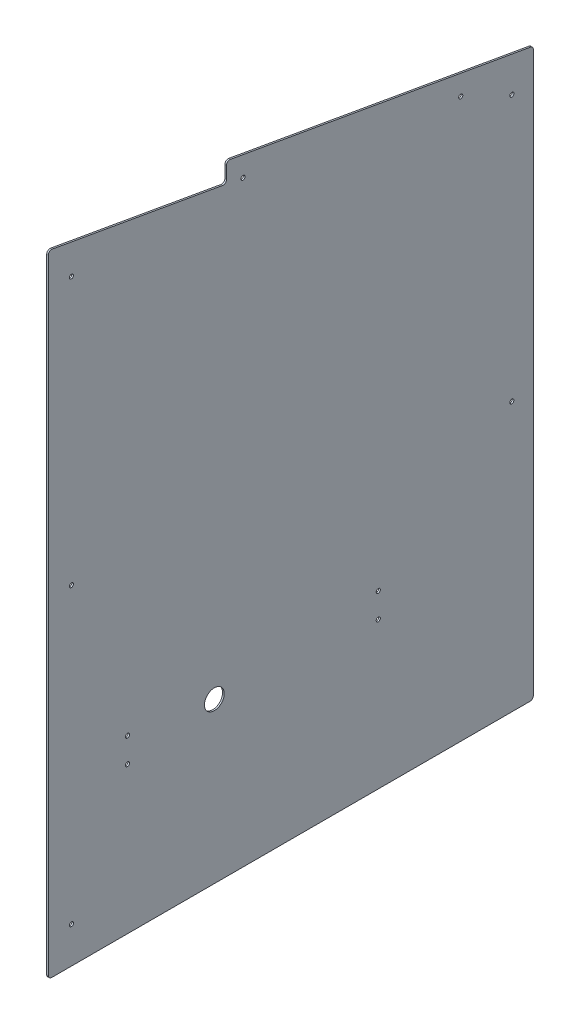
ISO-10303-21;
HEADER;
FILE_DESCRIPTION(('STEP AP214'),'2;1');
FILE_NAME('part.step','',(''),(''),'','','');
FILE_SCHEMA(('AUTOMOTIVE_DESIGN { 1 0 10303 214 1 1 1 1 }'));
ENDSEC;
DATA;
#1=APPLICATION_CONTEXT('core data for automotive mechanical design processes');
#2=APPLICATION_PROTOCOL_DEFINITION('international standard','automotive_design',2000,#1);
#3=PRODUCT_CONTEXT('',#1,'mechanical');
#4=PRODUCT('Part','Part','',(#3));
#5=PRODUCT_RELATED_PRODUCT_CATEGORY('part','',(#4));
#6=PRODUCT_DEFINITION_FORMATION('','',#4);
#7=PRODUCT_DEFINITION_CONTEXT('part definition',#1,'design');
#8=PRODUCT_DEFINITION('design','',#6,#7);
#9=PRODUCT_DEFINITION_SHAPE('','',#8);
#10=(LENGTH_UNIT() NAMED_UNIT(*) SI_UNIT(.MILLI.,.METRE.));
#11=(NAMED_UNIT(*) PLANE_ANGLE_UNIT() SI_UNIT($,.RADIAN.));
#12=(NAMED_UNIT(*) SI_UNIT($,.STERADIAN.) SOLID_ANGLE_UNIT());
#13=UNCERTAINTY_MEASURE_WITH_UNIT(LENGTH_MEASURE(1.E-05),#10,'distance_accuracy_value','');
#14=(GEOMETRIC_REPRESENTATION_CONTEXT(3) GLOBAL_UNCERTAINTY_ASSIGNED_CONTEXT((#13)) GLOBAL_UNIT_ASSIGNED_CONTEXT((#10,
#11,#12)) REPRESENTATION_CONTEXT('',''));
#15=CARTESIAN_POINT('',(0.,0.,0.));
#16=DIRECTION('',(0.,0.,1.));
#17=DIRECTION('',(1.,0.,0.));
#18=AXIS2_PLACEMENT_3D('',#15,#16,#17);
#19=CARTESIAN_POINT('',(3.175,1214.92966622947,0.));
#20=DIRECTION('',(0.,0.,-1.));
#21=DIRECTION('',(0.,1.,0.));
#22=AXIS2_PLACEMENT_3D('',#19,#20,#21);
#23=PLANE('',#22);
#24=DIRECTION('',(0.,-1.,0.));
#25=VECTOR('',#24,1.);
#26=CARTESIAN_POINT('',(0.,1214.92966622947,0.));
#27=LINE('',#26,#25);
#28=CARTESIAN_POINT('',(0.,1207.36203091649,0.));
#29=VERTEX_POINT('',#28);
#30=CARTESIAN_POINT('',(0.,6.35000000000008,0.));
#31=VERTEX_POINT('',#30);
#32=EDGE_CURVE('E157',#29,#31,#27,.T.);
#33=ORIENTED_EDGE('',*,*,#32,.T.);
#34=DIRECTION('',(-1.,0.,0.));
#35=VECTOR('',#34,1.);
#36=CARTESIAN_POINT('',(3.175,6.35000000000008,0.));
#37=LINE('',#36,#35);
#38=CARTESIAN_POINT('',(3.175,6.35000000000008,0.));
#39=VERTEX_POINT('',#38);
#40=EDGE_CURVE('E189',#31,#39,#37,.F.);
#41=ORIENTED_EDGE('',*,*,#40,.T.);
#42=DIRECTION('',(0.,-1.,0.));
#43=VECTOR('',#42,1.);
#44=CARTESIAN_POINT('',(3.175,1214.92966622947,0.));
#45=LINE('',#44,#43);
#46=CARTESIAN_POINT('',(3.175,1207.36203091649,0.));
#47=VERTEX_POINT('',#46);
#48=EDGE_CURVE('E165',#47,#39,#45,.T.);
#49=ORIENTED_EDGE('',*,*,#48,.F.);
#50=DIRECTION('',(-1.,0.,0.));
#51=VECTOR('',#50,1.);
#52=CARTESIAN_POINT('',(3.175,1207.36203091649,0.));
#53=LINE('',#52,#51);
#54=EDGE_CURVE('E186',#47,#29,#53,.T.);
#55=ORIENTED_EDGE('',*,*,#54,.T.);
#56=EDGE_LOOP('',(#33,#41,#49,#55));
#57=FACE_BOUND('',#56,.T.);
#58=ADVANCED_FACE('F35',(#57),#23,.F.);
#59=CARTESIAN_POINT('',(3.175,0.,0.));
#60=DIRECTION('',(0.,1.,0.));
#61=DIRECTION('',(0.,0.,1.));
#62=AXIS2_PLACEMENT_3D('',#59,#60,#61);
#63=PLANE('',#62);
#64=DIRECTION('',(0.,0.,-1.));
#65=VECTOR('',#64,1.);
#66=CARTESIAN_POINT('',(0.,0.,0.));
#67=LINE('',#66,#65);
#68=CARTESIAN_POINT('',(0.,0.,-6.35));
#69=VERTEX_POINT('',#68);
#70=CARTESIAN_POINT('',(0.,0.,-927.1));
#71=VERTEX_POINT('',#70);
#72=EDGE_CURVE('E152',#69,#71,#67,.T.);
#73=ORIENTED_EDGE('',*,*,#72,.T.);
#74=DIRECTION('',(-1.,0.,0.));
#75=VECTOR('',#74,1.);
#76=CARTESIAN_POINT('',(3.175,0.,-927.1));
#77=LINE('',#76,#75);
#78=CARTESIAN_POINT('',(3.175,0.,-927.1));
#79=VERTEX_POINT('',#78);
#80=EDGE_CURVE('E129',#71,#79,#77,.F.);
#81=ORIENTED_EDGE('',*,*,#80,.T.);
#82=DIRECTION('',(0.,0.,-1.));
#83=VECTOR('',#82,1.);
#84=CARTESIAN_POINT('',(3.175,0.,0.));
#85=LINE('',#84,#83);
#86=CARTESIAN_POINT('',(3.175,0.,-6.35));
#87=VERTEX_POINT('',#86);
#88=EDGE_CURVE('E239',#87,#79,#85,.T.);
#89=ORIENTED_EDGE('',*,*,#88,.F.);
#90=DIRECTION('',(-1.,0.,0.));
#91=VECTOR('',#90,1.);
#92=CARTESIAN_POINT('',(3.175,0.,-6.35));
#93=LINE('',#92,#91);
#94=EDGE_CURVE('E134',#87,#69,#93,.T.);
#95=ORIENTED_EDGE('',*,*,#94,.T.);
#96=EDGE_LOOP('',(#73,#81,#89,#95));
#97=FACE_BOUND('',#96,.T.);
#98=ADVANCED_FACE('F259',(#97),#63,.F.);
#99=CARTESIAN_POINT('',(3.175,0.,-933.45));
#100=DIRECTION('',(0.,0.,1.));
#101=DIRECTION('',(1.,0.,0.));
#102=AXIS2_PLACEMENT_3D('',#99,#100,#101);
#103=PLANE('',#102);
#104=DIRECTION('',(0.,1.,0.));
#105=VECTOR('',#104,1.);
#106=CARTESIAN_POINT('',(3.175,0.,-933.45));
#107=LINE('',#106,#105);
#108=CARTESIAN_POINT('',(3.175,6.35,-933.45));
#109=VERTEX_POINT('',#108);
#110=CARTESIAN_POINT('',(3.175,1083.69671734202,-933.45));
#111=VERTEX_POINT('',#110);
#112=EDGE_CURVE('E144',#109,#111,#107,.T.);
#113=ORIENTED_EDGE('',*,*,#112,.F.);
#114=DIRECTION('',(-1.,0.,0.));
#115=VECTOR('',#114,1.);
#116=CARTESIAN_POINT('',(3.175,6.35,-933.45));
#117=LINE('',#116,#115);
#118=CARTESIAN_POINT('',(0.,6.35,-933.45));
#119=VERTEX_POINT('',#118);
#120=EDGE_CURVE('E128',#109,#119,#117,.T.);
#121=ORIENTED_EDGE('',*,*,#120,.T.);
#122=DIRECTION('',(0.,1.,0.));
#123=VECTOR('',#122,1.);
#124=CARTESIAN_POINT('',(0.,0.,-933.45));
#125=LINE('',#124,#123);
#126=CARTESIAN_POINT('',(0.,1083.69671734202,-933.45));
#127=VERTEX_POINT('',#126);
#128=EDGE_CURVE('E141',#119,#127,#125,.T.);
#129=ORIENTED_EDGE('',*,*,#128,.T.);
#130=DIRECTION('',(-1.,0.,0.));
#131=VECTOR('',#130,1.);
#132=CARTESIAN_POINT('',(3.175,1083.69671734202,-933.45));
#133=LINE('',#132,#131);
#134=EDGE_CURVE('E146',#127,#111,#133,.F.);
#135=ORIENTED_EDGE('',*,*,#134,.T.);
#136=EDGE_LOOP('',(#113,#121,#129,#135));
#137=FACE_BOUND('',#136,.T.);
#138=ADVANCED_FACE('F140',(#137),#103,.F.);
#139=CARTESIAN_POINT('',(3.175,1089.025,-933.45));
#140=DIRECTION('',(0.,-0.984807753012209,0.173648177666926));
#141=DIRECTION('',(0.,-0.173648177666926,-0.984807753012209));
#142=AXIS2_PLACEMENT_3D('',#139,#140,#141);
#143=PLANE('',#142);
#144=DIRECTION('',(0.,0.173648177666926,0.984807753012209));
#145=VECTOR('',#144,1.);
#146=CARTESIAN_POINT('',(3.175,1089.025,-933.45));
#147=LINE('',#146,#145);
#148=CARTESIAN_POINT('',(3.175,1089.95024657365,-928.202665928185));
#149=VERTEX_POINT('',#148);
#150=CARTESIAN_POINT('',(3.175,1191.84079237604,-350.352665928185));
#151=VERTEX_POINT('',#150);
#152=EDGE_CURVE('E218',#149,#151,#147,.T.);
#153=ORIENTED_EDGE('',*,*,#152,.F.);
#154=DIRECTION('',(-1.,0.,0.));
#155=VECTOR('',#154,1.);
#156=CARTESIAN_POINT('',(3.175,1089.95024657365,-928.202665928185));
#157=LINE('',#156,#155);
#158=CARTESIAN_POINT('',(0.,1089.95024657365,-928.202665928185));
#159=VERTEX_POINT('',#158);
#160=EDGE_CURVE('E193',#149,#159,#157,.T.);
#161=ORIENTED_EDGE('',*,*,#160,.T.);
#162=DIRECTION('',(0.,0.173648177666926,0.984807753012209));
#163=VECTOR('',#162,1.);
#164=CARTESIAN_POINT('',(0.,1089.025,-933.45));
#165=LINE('',#164,#163);
#166=CARTESIAN_POINT('',(0.,1191.84079237604,-350.352665928185));
#167=VERTEX_POINT('',#166);
#168=EDGE_CURVE('E151',#159,#167,#165,.T.);
#169=ORIENTED_EDGE('',*,*,#168,.T.);
#170=DIRECTION('',(-1.,0.,0.));
#171=VECTOR('',#170,1.);
#172=CARTESIAN_POINT('',(3.175,1191.84079237604,-350.352665928185));
#173=LINE('',#172,#171);
#174=EDGE_CURVE('E191',#167,#151,#173,.F.);
#175=ORIENTED_EDGE('',*,*,#174,.T.);
#176=EDGE_LOOP('',(#153,#161,#169,#175));
#177=FACE_BOUND('',#176,.T.);
#178=ADVANCED_FACE('F252',(#177),#143,.F.);
#179=CARTESIAN_POINT('',(3.175,1193.15489845738,-342.9));
#180=DIRECTION('',(0.,0.,-1.));
#181=DIRECTION('',(-1.,0.,0.));
#182=AXIS2_PLACEMENT_3D('',#179,#180,#181);
#183=PLANE('',#182);
#184=DIRECTION('',(0.,-1.,0.));
#185=VECTOR('',#184,1.);
#186=CARTESIAN_POINT('',(3.175,1193.15489845738,-342.9));
#187=LINE('',#186,#185);
#188=CARTESIAN_POINT('',(3.175,1185.58726314441,-342.9));
#189=VERTEX_POINT('',#188);
#190=CARTESIAN_POINT('',(3.175,1162.03477985751,-342.9));
#191=VERTEX_POINT('',#190);
#192=EDGE_CURVE('E216',#189,#191,#187,.T.);
#193=ORIENTED_EDGE('',*,*,#192,.F.);
#194=DIRECTION('',(-1.,0.,0.));
#195=VECTOR('',#194,1.);
#196=CARTESIAN_POINT('',(3.175,1185.58726314441,-342.9));
#197=LINE('',#196,#195);
#198=CARTESIAN_POINT('',(0.,1185.58726314441,-342.9));
#199=VERTEX_POINT('',#198);
#200=EDGE_CURVE('E198',#189,#199,#197,.T.);
#201=ORIENTED_EDGE('',*,*,#200,.T.);
#202=DIRECTION('',(0.,-1.,0.));
#203=VECTOR('',#202,1.);
#204=CARTESIAN_POINT('',(0.,1193.15489845738,-342.9));
#205=LINE('',#204,#203);
#206=CARTESIAN_POINT('',(0.,1162.03477985751,-342.9));
#207=VERTEX_POINT('',#206);
#208=EDGE_CURVE('E155',#199,#207,#205,.T.);
#209=ORIENTED_EDGE('',*,*,#208,.T.);
#210=DIRECTION('',(-1.,0.,0.));
#211=VECTOR('',#210,1.);
#212=CARTESIAN_POINT('',(3.175,1162.03477985751,-342.9));
#213=LINE('',#212,#211);
#214=EDGE_CURVE('E196',#207,#191,#213,.F.);
#215=ORIENTED_EDGE('',*,*,#214,.T.);
#216=EDGE_LOOP('',(#193,#201,#209,#215));
#217=FACE_BOUND('',#216,.T.);
#218=ADVANCED_FACE('F211',(#217),#183,.F.);
#219=CARTESIAN_POINT('',(3.175,1154.46714454453,-342.9));
#220=DIRECTION('',(0.,-0.984807753012209,0.173648177666927));
#221=DIRECTION('',(0.,-0.173648177666927,-0.984807753012209));
#222=AXIS2_PLACEMENT_3D('',#219,#220,#221);
#223=PLANE('',#222);
#224=DIRECTION('',(0.,0.173648177666927,0.984807753012209));
#225=VECTOR('',#224,1.);
#226=CARTESIAN_POINT('',(3.175,1154.46714454453,-342.9));
#227=LINE('',#226,#225);
#228=CARTESIAN_POINT('',(3.175,1155.78125062588,-335.447334071815));
#229=VERTEX_POINT('',#228);
#230=CARTESIAN_POINT('',(3.175,1213.61556014812,-7.45266592818505));
#231=VERTEX_POINT('',#230);
#232=EDGE_CURVE('E166',#229,#231,#227,.T.);
#233=ORIENTED_EDGE('',*,*,#232,.F.);
#234=DIRECTION('',(-1.,0.,0.));
#235=VECTOR('',#234,1.);
#236=CARTESIAN_POINT('',(0.,1155.78125062588,-335.447334071815));
#237=LINE('',#236,#235);
#238=CARTESIAN_POINT('',(0.,1155.78125062588,-335.447334071815));
#239=VERTEX_POINT('',#238);
#240=EDGE_CURVE('E202',#229,#239,#237,.T.);
#241=ORIENTED_EDGE('',*,*,#240,.T.);
#242=DIRECTION('',(0.,0.173648177666927,0.984807753012209));
#243=VECTOR('',#242,1.);
#244=CARTESIAN_POINT('',(0.,1154.46714454453,-342.9));
#245=LINE('',#244,#243);
#246=CARTESIAN_POINT('',(0.,1213.61556014812,-7.45266592818505));
#247=VERTEX_POINT('',#246);
#248=EDGE_CURVE('E163',#239,#247,#245,.T.);
#249=ORIENTED_EDGE('',*,*,#248,.T.);
#250=DIRECTION('',(-1.,0.,0.));
#251=VECTOR('',#250,1.);
#252=CARTESIAN_POINT('',(3.175,1213.61556014812,-7.452665928185));
#253=LINE('',#252,#251);
#254=EDGE_CURVE('E50',#247,#231,#253,.F.);
#255=ORIENTED_EDGE('',*,*,#254,.T.);
#256=EDGE_LOOP('',(#233,#241,#249,#255));
#257=FACE_BOUND('',#256,.T.);
#258=ADVANCED_FACE('F214',(#257),#223,.F.);
#259=CARTESIAN_POINT('',(3.175,0.,0.));
#260=DIRECTION('',(1.,0.,0.));
#261=DIRECTION('',(0.,0.,-1.));
#262=AXIS2_PLACEMENT_3D('',#259,#260,#261);
#263=PLANE('',#262);
#264=CARTESIAN_POINT('',(3.175,1149.35,-44.45));
#265=DIRECTION('',(1.,0.,0.));
#266=DIRECTION('',(0.,0.,-1.));
#267=AXIS2_PLACEMENT_3D('',#264,#265,#266);
#268=CIRCLE('',#267,3.96875000000008);
#269=CARTESIAN_POINT('',(3.175,1149.35,-48.4187500000001));
#270=VERTEX_POINT('',#269);
#271=EDGE_CURVE('E481',#270,#270,#268,.T.);
#272=ORIENTED_EDGE('',*,*,#271,.F.);
#273=EDGE_LOOP('',(#272));
#274=FACE_BOUND('',#273,.T.);
#275=CARTESIAN_POINT('',(3.175,635.,-44.45));
#276=DIRECTION('',(1.,0.,0.));
#277=DIRECTION('',(0.,0.,-1.));
#278=AXIS2_PLACEMENT_3D('',#275,#276,#277);
#279=CIRCLE('',#278,3.96874999999997);
#280=CARTESIAN_POINT('',(3.175,635.,-48.41875));
#281=VERTEX_POINT('',#280);
#282=EDGE_CURVE('E483',#281,#281,#279,.T.);
#283=ORIENTED_EDGE('',*,*,#282,.F.);
#284=EDGE_LOOP('',(#283));
#285=FACE_BOUND('',#284,.T.);
#286=CARTESIAN_POINT('',(3.175,330.2,-152.4));
#287=DIRECTION('',(1.,0.,0.));
#288=DIRECTION('',(0.,0.,-1.));
#289=AXIS2_PLACEMENT_3D('',#286,#287,#288);
#290=CIRCLE('',#289,3.96874999999997);
#291=CARTESIAN_POINT('',(3.175,330.2,-156.36875));
#292=VERTEX_POINT('',#291);
#293=EDGE_CURVE('E491',#292,#292,#290,.T.);
#294=ORIENTED_EDGE('',*,*,#293,.F.);
#295=EDGE_LOOP('',(#294));
#296=FACE_BOUND('',#295,.T.);
#297=CARTESIAN_POINT('',(3.175,282.575,-152.4));
#298=DIRECTION('',(1.,0.,0.));
#299=DIRECTION('',(0.,0.,-1.));
#300=AXIS2_PLACEMENT_3D('',#297,#298,#299);
#301=CIRCLE('',#300,3.96874999999997);
#302=CARTESIAN_POINT('',(3.175,282.575,-156.36875));
#303=VERTEX_POINT('',#302);
#304=EDGE_CURVE('E497',#303,#303,#301,.T.);
#305=ORIENTED_EDGE('',*,*,#304,.F.);
#306=EDGE_LOOP('',(#305));
#307=FACE_BOUND('',#306,.T.);
#308=CARTESIAN_POINT('',(3.175,330.2,-635.));
#309=DIRECTION('',(1.,0.,0.));
#310=DIRECTION('',(0.,0.,-1.));
#311=AXIS2_PLACEMENT_3D('',#308,#309,#310);
#312=CIRCLE('',#311,3.96874999999997);
#313=CARTESIAN_POINT('',(3.175,330.2,-638.96875));
#314=VERTEX_POINT('',#313);
#315=EDGE_CURVE('E503',#314,#314,#312,.T.);
#316=ORIENTED_EDGE('',*,*,#315,.F.);
#317=EDGE_LOOP('',(#316));
#318=FACE_BOUND('',#317,.T.);
#319=CARTESIAN_POINT('',(3.175,282.575,-635.));
#320=DIRECTION('',(1.,0.,0.));
#321=DIRECTION('',(0.,0.,-1.));
#322=AXIS2_PLACEMENT_3D('',#319,#320,#321);
#323=CIRCLE('',#322,3.96874999999997);
#324=CARTESIAN_POINT('',(3.175,282.575,-638.96875));
#325=VERTEX_POINT('',#324);
#326=EDGE_CURVE('E509',#325,#325,#323,.T.);
#327=ORIENTED_EDGE('',*,*,#326,.F.);
#328=EDGE_LOOP('',(#327));
#329=FACE_BOUND('',#328,.T.);
#330=CARTESIAN_POINT('',(3.175,517.525,-892.175));
#331=DIRECTION('',(1.,0.,0.));
#332=DIRECTION('',(0.,0.,-1.));
#333=AXIS2_PLACEMENT_3D('',#330,#331,#332);
#334=CIRCLE('',#333,3.96874999999997);
#335=CARTESIAN_POINT('',(3.175,517.525,-896.14375));
#336=VERTEX_POINT('',#335);
#337=EDGE_CURVE('E515',#336,#336,#334,.T.);
#338=ORIENTED_EDGE('',*,*,#337,.F.);
#339=EDGE_LOOP('',(#338));
#340=FACE_BOUND('',#339,.T.);
#341=CARTESIAN_POINT('',(3.175,1028.7,-892.175));
#342=DIRECTION('',(1.,0.,0.));
#343=DIRECTION('',(0.,0.,-1.));
#344=AXIS2_PLACEMENT_3D('',#341,#342,#343);
#345=CIRCLE('',#344,3.96875000000008);
#346=CARTESIAN_POINT('',(3.175,1028.7,-896.14375));
#347=VERTEX_POINT('',#346);
#348=EDGE_CURVE('E521',#347,#347,#345,.T.);
#349=ORIENTED_EDGE('',*,*,#348,.F.);
#350=EDGE_LOOP('',(#349));
#351=FACE_BOUND('',#350,.T.);
#352=CARTESIAN_POINT('',(3.175,1148.86876290704,-374.65));
#353=DIRECTION('',(1.,0.,0.));
#354=DIRECTION('',(0.,0.,-1.));
#355=AXIS2_PLACEMENT_3D('',#352,#353,#354);
#356=CIRCLE('',#355,3.96875000000008);
#357=CARTESIAN_POINT('',(3.175,1148.86876290704,-378.61875));
#358=VERTEX_POINT('',#357);
#359=EDGE_CURVE('E527',#358,#358,#356,.T.);
#360=ORIENTED_EDGE('',*,*,#359,.F.);
#361=EDGE_LOOP('',(#360));
#362=FACE_BOUND('',#361,.T.);
#363=CARTESIAN_POINT('',(3.175,1074.97012529213,-793.75));
#364=DIRECTION('',(1.,0.,0.));
#365=DIRECTION('',(0.,0.,-1.));
#366=AXIS2_PLACEMENT_3D('',#363,#364,#365);
#367=CIRCLE('',#366,3.96875000000008);
#368=CARTESIAN_POINT('',(3.175,1074.97012529213,-797.71875));
#369=VERTEX_POINT('',#368);
#370=EDGE_CURVE('E533',#369,#369,#367,.T.);
#371=ORIENTED_EDGE('',*,*,#370,.F.);
#372=EDGE_LOOP('',(#371));
#373=FACE_BOUND('',#372,.T.);
#374=CARTESIAN_POINT('',(3.175,69.85,-44.45));
#375=DIRECTION('',(1.,0.,0.));
#376=DIRECTION('',(0.,0.,-1.));
#377=AXIS2_PLACEMENT_3D('',#374,#375,#376);
#378=CIRCLE('',#377,3.96874999999999);
#379=CARTESIAN_POINT('',(3.175,69.85,-48.41875));
#380=VERTEX_POINT('',#379);
#381=EDGE_CURVE('E538',#380,#380,#378,.T.);
#382=ORIENTED_EDGE('',*,*,#381,.F.);
#383=EDGE_LOOP('',(#382));
#384=FACE_BOUND('',#383,.T.);
#385=CARTESIAN_POINT('',(3.175,307.34,-319.532));
#386=DIRECTION('',(1.,0.,0.));
#387=DIRECTION('',(0.,0.,-1.));
#388=AXIS2_PLACEMENT_3D('',#385,#386,#387);
#389=CIRCLE('',#388,19.05);
#390=CARTESIAN_POINT('',(3.175,307.34,-338.582));
#391=VERTEX_POINT('',#390);
#392=EDGE_CURVE('E227',#391,#391,#389,.T.);
#393=ORIENTED_EDGE('',*,*,#392,.F.);
#394=EDGE_LOOP('',(#393));
#395=FACE_BOUND('',#394,.T.);
#396=ORIENTED_EDGE('',*,*,#88,.T.);
#397=CARTESIAN_POINT('',(3.175,6.35,-927.1));
#398=DIRECTION('',(1.,0.,0.));
#399=DIRECTION('',(0.,0.,-1.));
#400=AXIS2_PLACEMENT_3D('',#397,#398,#399);
#401=CIRCLE('',#400,6.35);
#402=EDGE_CURVE('E184',#79,#109,#401,.T.);
#403=ORIENTED_EDGE('',*,*,#402,.T.);
#404=ORIENTED_EDGE('',*,*,#112,.T.);
#405=CARTESIAN_POINT('',(3.175,1083.69671734202,-927.1));
#406=DIRECTION('',(1.,0.,0.));
#407=DIRECTION('',(0.,0.,-1.));
#408=AXIS2_PLACEMENT_3D('',#405,#406,#407);
#409=CIRCLE('',#408,6.35);
#410=EDGE_CURVE('E180',#111,#149,#409,.T.);
#411=ORIENTED_EDGE('',*,*,#410,.T.);
#412=ORIENTED_EDGE('',*,*,#152,.T.);
#413=CARTESIAN_POINT('',(3.175,1185.58726314441,-349.25));
#414=DIRECTION('',(1.,0.,0.));
#415=DIRECTION('',(0.,0.,-1.));
#416=AXIS2_PLACEMENT_3D('',#413,#414,#415);
#417=CIRCLE('',#416,6.35);
#418=EDGE_CURVE('E178',#151,#189,#417,.T.);
#419=ORIENTED_EDGE('',*,*,#418,.T.);
#420=ORIENTED_EDGE('',*,*,#192,.T.);
#421=CARTESIAN_POINT('',(3.175,1162.03477985751,-336.55));
#422=DIRECTION('',(1.,0.,0.));
#423=DIRECTION('',(0.,0.,-1.));
#424=AXIS2_PLACEMENT_3D('',#421,#422,#423);
#425=CIRCLE('',#424,6.35);
#426=EDGE_CURVE('E11',#191,#229,#425,.F.);
#427=ORIENTED_EDGE('',*,*,#426,.T.);
#428=ORIENTED_EDGE('',*,*,#232,.T.);
#429=CARTESIAN_POINT('',(3.175,1207.36203091649,-6.35));
#430=DIRECTION('',(1.,0.,0.));
#431=DIRECTION('',(0.,0.,-1.));
#432=AXIS2_PLACEMENT_3D('',#429,#430,#431);
#433=CIRCLE('',#432,6.35);
#434=EDGE_CURVE('E176',#231,#47,#433,.T.);
#435=ORIENTED_EDGE('',*,*,#434,.T.);
#436=ORIENTED_EDGE('',*,*,#48,.T.);
#437=CARTESIAN_POINT('',(3.175,6.35,-6.35));
#438=DIRECTION('',(1.,0.,0.));
#439=DIRECTION('',(0.,0.,-1.));
#440=AXIS2_PLACEMENT_3D('',#437,#438,#439);
#441=CIRCLE('',#440,6.35);
#442=EDGE_CURVE('E182',#39,#87,#441,.T.);
#443=ORIENTED_EDGE('',*,*,#442,.T.);
#444=EDGE_LOOP('',(#396,#403,#404,#411,#412,#419,#420,#427,#428,#435,#436,#443));
#445=FACE_BOUND('',#444,.T.);
#446=ADVANCED_FACE('F245',(#274,#285,#296,#307,#318,#329,#340,#351,#362,#373,#384,#395,#445),
#263,.T.);
#447=CARTESIAN_POINT('',(0.,0.,0.));
#448=DIRECTION('',(1.,0.,0.));
#449=DIRECTION('',(0.,0.,-1.));
#450=AXIS2_PLACEMENT_3D('',#447,#448,#449);
#451=PLANE('',#450);
#452=CARTESIAN_POINT('',(0.,1149.35,-44.45));
#453=DIRECTION('',(1.,0.,0.));
#454=DIRECTION('',(0.,0.,-1.));
#455=AXIS2_PLACEMENT_3D('',#452,#453,#454);
#456=CIRCLE('',#455,3.96875000000008);
#457=CARTESIAN_POINT('',(0.,1149.35,-48.4187500000001));
#458=VERTEX_POINT('',#457);
#459=EDGE_CURVE('E478',#458,#458,#456,.T.);
#460=ORIENTED_EDGE('',*,*,#459,.T.);
#461=EDGE_LOOP('',(#460));
#462=FACE_BOUND('',#461,.T.);
#463=CARTESIAN_POINT('',(0.,635.,-44.45));
#464=DIRECTION('',(1.,0.,0.));
#465=DIRECTION('',(0.,0.,-1.));
#466=AXIS2_PLACEMENT_3D('',#463,#464,#465);
#467=CIRCLE('',#466,3.96874999999997);
#468=CARTESIAN_POINT('',(0.,635.,-48.41875));
#469=VERTEX_POINT('',#468);
#470=EDGE_CURVE('E488',#469,#469,#467,.T.);
#471=ORIENTED_EDGE('',*,*,#470,.T.);
#472=EDGE_LOOP('',(#471));
#473=FACE_BOUND('',#472,.T.);
#474=CARTESIAN_POINT('',(0.,330.2,-152.4));
#475=DIRECTION('',(1.,0.,0.));
#476=DIRECTION('',(0.,0.,-1.));
#477=AXIS2_PLACEMENT_3D('',#474,#475,#476);
#478=CIRCLE('',#477,3.96875000000002);
#479=CARTESIAN_POINT('',(0.,330.2,-156.36875));
#480=VERTEX_POINT('',#479);
#481=EDGE_CURVE('E494',#480,#480,#478,.T.);
#482=ORIENTED_EDGE('',*,*,#481,.T.);
#483=EDGE_LOOP('',(#482));
#484=FACE_BOUND('',#483,.T.);
#485=CARTESIAN_POINT('',(0.,282.575,-152.4));
#486=DIRECTION('',(1.,0.,0.));
#487=DIRECTION('',(0.,0.,-1.));
#488=AXIS2_PLACEMENT_3D('',#485,#486,#487);
#489=CIRCLE('',#488,3.96875000000002);
#490=CARTESIAN_POINT('',(0.,282.575,-156.36875));
#491=VERTEX_POINT('',#490);
#492=EDGE_CURVE('E500',#491,#491,#489,.T.);
#493=ORIENTED_EDGE('',*,*,#492,.T.);
#494=EDGE_LOOP('',(#493));
#495=FACE_BOUND('',#494,.T.);
#496=CARTESIAN_POINT('',(0.,330.2,-635.));
#497=DIRECTION('',(1.,0.,0.));
#498=DIRECTION('',(0.,0.,-1.));
#499=AXIS2_PLACEMENT_3D('',#496,#497,#498);
#500=CIRCLE('',#499,3.96875000000002);
#501=CARTESIAN_POINT('',(0.,330.2,-638.96875));
#502=VERTEX_POINT('',#501);
#503=EDGE_CURVE('E506',#502,#502,#500,.T.);
#504=ORIENTED_EDGE('',*,*,#503,.T.);
#505=EDGE_LOOP('',(#504));
#506=FACE_BOUND('',#505,.T.);
#507=CARTESIAN_POINT('',(0.,282.575,-635.));
#508=DIRECTION('',(1.,0.,0.));
#509=DIRECTION('',(0.,0.,-1.));
#510=AXIS2_PLACEMENT_3D('',#507,#508,#509);
#511=CIRCLE('',#510,3.96875000000002);
#512=CARTESIAN_POINT('',(0.,282.575,-638.96875));
#513=VERTEX_POINT('',#512);
#514=EDGE_CURVE('E512',#513,#513,#511,.T.);
#515=ORIENTED_EDGE('',*,*,#514,.T.);
#516=EDGE_LOOP('',(#515));
#517=FACE_BOUND('',#516,.T.);
#518=CARTESIAN_POINT('',(0.,517.525,-892.175));
#519=DIRECTION('',(1.,0.,0.));
#520=DIRECTION('',(0.,0.,-1.));
#521=AXIS2_PLACEMENT_3D('',#518,#519,#520);
#522=CIRCLE('',#521,3.96874999999997);
#523=CARTESIAN_POINT('',(0.,517.525,-896.14375));
#524=VERTEX_POINT('',#523);
#525=EDGE_CURVE('E518',#524,#524,#522,.T.);
#526=ORIENTED_EDGE('',*,*,#525,.T.);
#527=EDGE_LOOP('',(#526));
#528=FACE_BOUND('',#527,.T.);
#529=CARTESIAN_POINT('',(0.,1028.7,-892.175));
#530=DIRECTION('',(1.,0.,0.));
#531=DIRECTION('',(0.,0.,-1.));
#532=AXIS2_PLACEMENT_3D('',#529,#530,#531);
#533=CIRCLE('',#532,3.96875000000008);
#534=CARTESIAN_POINT('',(0.,1028.7,-896.14375));
#535=VERTEX_POINT('',#534);
#536=EDGE_CURVE('E524',#535,#535,#533,.T.);
#537=ORIENTED_EDGE('',*,*,#536,.T.);
#538=EDGE_LOOP('',(#537));
#539=FACE_BOUND('',#538,.T.);
#540=CARTESIAN_POINT('',(0.,1148.86876290704,-374.65));
#541=DIRECTION('',(1.,0.,0.));
#542=DIRECTION('',(0.,0.,-1.));
#543=AXIS2_PLACEMENT_3D('',#540,#541,#542);
#544=CIRCLE('',#543,3.96875000000008);
#545=CARTESIAN_POINT('',(0.,1148.86876290704,-378.61875));
#546=VERTEX_POINT('',#545);
#547=EDGE_CURVE('E530',#546,#546,#544,.T.);
#548=ORIENTED_EDGE('',*,*,#547,.T.);
#549=EDGE_LOOP('',(#548));
#550=FACE_BOUND('',#549,.T.);
#551=CARTESIAN_POINT('',(0.,1074.97012529213,-793.75));
#552=DIRECTION('',(1.,0.,0.));
#553=DIRECTION('',(0.,0.,-1.));
#554=AXIS2_PLACEMENT_3D('',#551,#552,#553);
#555=CIRCLE('',#554,3.96875000000008);
#556=CARTESIAN_POINT('',(0.,1074.97012529213,-797.71875));
#557=VERTEX_POINT('',#556);
#558=EDGE_CURVE('E536',#557,#557,#555,.T.);
#559=ORIENTED_EDGE('',*,*,#558,.T.);
#560=EDGE_LOOP('',(#559));
#561=FACE_BOUND('',#560,.T.);
#562=CARTESIAN_POINT('',(0.,69.85,-44.45));
#563=DIRECTION('',(1.,0.,0.));
#564=DIRECTION('',(0.,0.,-1.));
#565=AXIS2_PLACEMENT_3D('',#562,#563,#564);
#566=CIRCLE('',#565,3.96874999999999);
#567=CARTESIAN_POINT('',(0.,69.85,-48.41875));
#568=VERTEX_POINT('',#567);
#569=EDGE_CURVE('E232',#568,#568,#566,.T.);
#570=ORIENTED_EDGE('',*,*,#569,.T.);
#571=EDGE_LOOP('',(#570));
#572=FACE_BOUND('',#571,.T.);
#573=CARTESIAN_POINT('',(0.,307.34,-319.532));
#574=DIRECTION('',(1.,0.,0.));
#575=DIRECTION('',(0.,0.,-1.));
#576=AXIS2_PLACEMENT_3D('',#573,#574,#575);
#577=CIRCLE('',#576,19.05);
#578=CARTESIAN_POINT('',(0.,307.34,-338.582));
#579=VERTEX_POINT('',#578);
#580=EDGE_CURVE('E222',#579,#579,#577,.T.);
#581=ORIENTED_EDGE('',*,*,#580,.T.);
#582=EDGE_LOOP('',(#581));
#583=FACE_BOUND('',#582,.T.);
#584=ORIENTED_EDGE('',*,*,#128,.F.);
#585=CARTESIAN_POINT('',(0.,6.35,-927.1));
#586=DIRECTION('',(1.,0.,0.));
#587=DIRECTION('',(0.,0.,-1.));
#588=AXIS2_PLACEMENT_3D('',#585,#586,#587);
#589=CIRCLE('',#588,6.35);
#590=EDGE_CURVE('E124',#119,#71,#589,.F.);
#591=ORIENTED_EDGE('',*,*,#590,.T.);
#592=ORIENTED_EDGE('',*,*,#72,.F.);
#593=CARTESIAN_POINT('',(0.,6.35,-6.35));
#594=DIRECTION('',(1.,0.,0.));
#595=DIRECTION('',(0.,0.,-1.));
#596=AXIS2_PLACEMENT_3D('',#593,#594,#595);
#597=CIRCLE('',#596,6.35);
#598=EDGE_CURVE('E135',#69,#31,#597,.F.);
#599=ORIENTED_EDGE('',*,*,#598,.T.);
#600=ORIENTED_EDGE('',*,*,#32,.F.);
#601=CARTESIAN_POINT('',(0.,1207.36203091649,-6.35));
#602=DIRECTION('',(1.,0.,0.));
#603=DIRECTION('',(0.,0.,-1.));
#604=AXIS2_PLACEMENT_3D('',#601,#602,#603);
#605=CIRCLE('',#604,6.35);
#606=EDGE_CURVE('E145',#29,#247,#605,.F.);
#607=ORIENTED_EDGE('',*,*,#606,.T.);
#608=ORIENTED_EDGE('',*,*,#248,.F.);
#609=CARTESIAN_POINT('',(0.,1162.03477985751,-336.55));
#610=DIRECTION('',(1.,0.,0.));
#611=DIRECTION('',(0.,0.,-1.));
#612=AXIS2_PLACEMENT_3D('',#609,#610,#611);
#613=CIRCLE('',#612,6.35);
#614=EDGE_CURVE('E43',#239,#207,#613,.T.);
#615=ORIENTED_EDGE('',*,*,#614,.T.);
#616=ORIENTED_EDGE('',*,*,#208,.F.);
#617=CARTESIAN_POINT('',(0.,1185.58726314441,-349.25));
#618=DIRECTION('',(1.,0.,0.));
#619=DIRECTION('',(0.,0.,-1.));
#620=AXIS2_PLACEMENT_3D('',#617,#618,#619);
#621=CIRCLE('',#620,6.35);
#622=EDGE_CURVE('E169',#199,#167,#621,.F.);
#623=ORIENTED_EDGE('',*,*,#622,.T.);
#624=ORIENTED_EDGE('',*,*,#168,.F.);
#625=CARTESIAN_POINT('',(0.,1083.69671734202,-927.1));
#626=DIRECTION('',(1.,0.,0.));
#627=DIRECTION('',(0.,0.,-1.));
#628=AXIS2_PLACEMENT_3D('',#625,#626,#627);
#629=CIRCLE('',#628,6.35);
#630=EDGE_CURVE('E150',#159,#127,#629,.F.);
#631=ORIENTED_EDGE('',*,*,#630,.T.);
#632=EDGE_LOOP('',(#584,#591,#592,#599,#600,#607,#608,#615,#616,#623,#624,#631));
#633=FACE_BOUND('',#632,.T.);
#634=ADVANCED_FACE('F148',(#462,#473,#484,#495,#506,#517,#528,#539,#550,#561,#572,#583,#633),
#451,.F.);
#635=CARTESIAN_POINT('',(0.,307.34,-319.532));
#636=DIRECTION('',(1.,0.,0.));
#637=DIRECTION('',(0.,0.,-1.));
#638=AXIS2_PLACEMENT_3D('',#635,#636,#637);
#639=CYLINDRICAL_SURFACE('',#638,19.05);
#640=ORIENTED_EDGE('',*,*,#580,.F.);
#641=EDGE_LOOP('',(#640));
#642=FACE_BOUND('',#641,.T.);
#643=ORIENTED_EDGE('',*,*,#392,.T.);
#644=EDGE_LOOP('',(#643));
#645=FACE_BOUND('',#644,.T.);
#646=ADVANCED_FACE('F275',(#642,#645),#639,.F.);
#647=CARTESIAN_POINT('',(3.175,6.35,-927.1));
#648=DIRECTION('',(-1.,0.,0.));
#649=DIRECTION('',(0.,0.,1.));
#650=AXIS2_PLACEMENT_3D('',#647,#648,#649);
#651=CYLINDRICAL_SURFACE('',#650,6.35);
#652=ORIENTED_EDGE('',*,*,#402,.F.);
#653=ORIENTED_EDGE('',*,*,#80,.F.);
#654=ORIENTED_EDGE('',*,*,#590,.F.);
#655=ORIENTED_EDGE('',*,*,#120,.F.);
#656=EDGE_LOOP('',(#652,#653,#654,#655));
#657=FACE_BOUND('',#656,.T.);
#658=ADVANCED_FACE('F127',(#657),#651,.T.);
#659=CARTESIAN_POINT('',(3.175,6.35,-6.35));
#660=DIRECTION('',(-1.,0.,0.));
#661=DIRECTION('',(0.,0.,1.));
#662=AXIS2_PLACEMENT_3D('',#659,#660,#661);
#663=CYLINDRICAL_SURFACE('',#662,6.35);
#664=ORIENTED_EDGE('',*,*,#442,.F.);
#665=ORIENTED_EDGE('',*,*,#40,.F.);
#666=ORIENTED_EDGE('',*,*,#598,.F.);
#667=ORIENTED_EDGE('',*,*,#94,.F.);
#668=EDGE_LOOP('',(#664,#665,#666,#667));
#669=FACE_BOUND('',#668,.T.);
#670=ADVANCED_FACE('F261',(#669),#663,.T.);
#671=CARTESIAN_POINT('',(3.175,1083.69671734202,-927.1));
#672=DIRECTION('',(-1.,0.,0.));
#673=DIRECTION('',(0.,0.,1.));
#674=AXIS2_PLACEMENT_3D('',#671,#672,#673);
#675=CYLINDRICAL_SURFACE('',#674,6.35);
#676=ORIENTED_EDGE('',*,*,#410,.F.);
#677=ORIENTED_EDGE('',*,*,#134,.F.);
#678=ORIENTED_EDGE('',*,*,#630,.F.);
#679=ORIENTED_EDGE('',*,*,#160,.F.);
#680=EDGE_LOOP('',(#676,#677,#678,#679));
#681=FACE_BOUND('',#680,.T.);
#682=ADVANCED_FACE('F254',(#681),#675,.T.);
#683=CARTESIAN_POINT('',(3.175,1185.58726314441,-349.25));
#684=DIRECTION('',(-1.,0.,0.));
#685=DIRECTION('',(0.,0.,1.));
#686=AXIS2_PLACEMENT_3D('',#683,#684,#685);
#687=CYLINDRICAL_SURFACE('',#686,6.35);
#688=ORIENTED_EDGE('',*,*,#418,.F.);
#689=ORIENTED_EDGE('',*,*,#174,.F.);
#690=ORIENTED_EDGE('',*,*,#622,.F.);
#691=ORIENTED_EDGE('',*,*,#200,.F.);
#692=EDGE_LOOP('',(#688,#689,#690,#691));
#693=FACE_BOUND('',#692,.T.);
#694=ADVANCED_FACE('F251',(#693),#687,.T.);
#695=CARTESIAN_POINT('',(3.175,1162.03477985751,-336.55));
#696=DIRECTION('',(1.,0.,0.));
#697=DIRECTION('',(0.,0.,-1.));
#698=AXIS2_PLACEMENT_3D('',#695,#696,#697);
#699=CYLINDRICAL_SURFACE('',#698,6.35);
#700=ORIENTED_EDGE('',*,*,#426,.F.);
#701=ORIENTED_EDGE('',*,*,#214,.F.);
#702=ORIENTED_EDGE('',*,*,#614,.F.);
#703=ORIENTED_EDGE('',*,*,#240,.F.);
#704=EDGE_LOOP('',(#700,#701,#702,#703));
#705=FACE_BOUND('',#704,.T.);
#706=ADVANCED_FACE('F213',(#705),#699,.F.);
#707=CARTESIAN_POINT('',(3.175,1207.36203091649,-6.35));
#708=DIRECTION('',(-1.,0.,0.));
#709=DIRECTION('',(0.,0.,1.));
#710=AXIS2_PLACEMENT_3D('',#707,#708,#709);
#711=CYLINDRICAL_SURFACE('',#710,6.35);
#712=ORIENTED_EDGE('',*,*,#434,.F.);
#713=ORIENTED_EDGE('',*,*,#254,.F.);
#714=ORIENTED_EDGE('',*,*,#606,.F.);
#715=ORIENTED_EDGE('',*,*,#54,.F.);
#716=EDGE_LOOP('',(#712,#713,#714,#715));
#717=FACE_BOUND('',#716,.T.);
#718=ADVANCED_FACE('F37',(#717),#711,.T.);
#719=CARTESIAN_POINT('',(3.175,69.85,-44.45));
#720=DIRECTION('',(1.,0.,0.));
#721=DIRECTION('',(0.,0.,-1.));
#722=AXIS2_PLACEMENT_3D('',#719,#720,#721);
#723=CYLINDRICAL_SURFACE('',#722,3.96874999999999);
#724=ORIENTED_EDGE('',*,*,#569,.F.);
#725=EDGE_LOOP('',(#724));
#726=FACE_BOUND('',#725,.T.);
#727=ORIENTED_EDGE('',*,*,#381,.T.);
#728=EDGE_LOOP('',(#727));
#729=FACE_BOUND('',#728,.T.);
#730=ADVANCED_FACE('F285',(#726,#729),#723,.F.);
#731=CARTESIAN_POINT('',(3.175,1074.97012529213,-793.75));
#732=DIRECTION('',(1.,0.,0.));
#733=DIRECTION('',(0.,0.,-1.));
#734=AXIS2_PLACEMENT_3D('',#731,#732,#733);
#735=CYLINDRICAL_SURFACE('',#734,3.96875000000008);
#736=ORIENTED_EDGE('',*,*,#558,.F.);
#737=EDGE_LOOP('',(#736));
#738=FACE_BOUND('',#737,.T.);
#739=ORIENTED_EDGE('',*,*,#370,.T.);
#740=EDGE_LOOP('',(#739));
#741=FACE_BOUND('',#740,.T.);
#742=ADVANCED_FACE('F289',(#738,#741),#735,.F.);
#743=CARTESIAN_POINT('',(3.175,1148.86876290704,-374.65));
#744=DIRECTION('',(1.,0.,0.));
#745=DIRECTION('',(0.,0.,-1.));
#746=AXIS2_PLACEMENT_3D('',#743,#744,#745);
#747=CYLINDRICAL_SURFACE('',#746,3.96875000000008);
#748=ORIENTED_EDGE('',*,*,#547,.F.);
#749=EDGE_LOOP('',(#748));
#750=FACE_BOUND('',#749,.T.);
#751=ORIENTED_EDGE('',*,*,#359,.T.);
#752=EDGE_LOOP('',(#751));
#753=FACE_BOUND('',#752,.T.);
#754=ADVANCED_FACE('F295',(#750,#753),#747,.F.);
#755=CARTESIAN_POINT('',(3.175,1028.7,-892.175));
#756=DIRECTION('',(1.,0.,0.));
#757=DIRECTION('',(0.,0.,-1.));
#758=AXIS2_PLACEMENT_3D('',#755,#756,#757);
#759=CYLINDRICAL_SURFACE('',#758,3.96875000000008);
#760=ORIENTED_EDGE('',*,*,#536,.F.);
#761=EDGE_LOOP('',(#760));
#762=FACE_BOUND('',#761,.T.);
#763=ORIENTED_EDGE('',*,*,#348,.T.);
#764=EDGE_LOOP('',(#763));
#765=FACE_BOUND('',#764,.T.);
#766=ADVANCED_FACE('F392',(#762,#765),#759,.F.);
#767=CARTESIAN_POINT('',(3.175,517.525,-892.175));
#768=DIRECTION('',(1.,0.,0.));
#769=DIRECTION('',(0.,0.,-1.));
#770=AXIS2_PLACEMENT_3D('',#767,#768,#769);
#771=CYLINDRICAL_SURFACE('',#770,3.96874999999997);
#772=ORIENTED_EDGE('',*,*,#525,.F.);
#773=EDGE_LOOP('',(#772));
#774=FACE_BOUND('',#773,.T.);
#775=ORIENTED_EDGE('',*,*,#337,.T.);
#776=EDGE_LOOP('',(#775));
#777=FACE_BOUND('',#776,.T.);
#778=ADVANCED_FACE('F400',(#774,#777),#771,.F.);
#779=CARTESIAN_POINT('',(3.175,282.575,-635.));
#780=DIRECTION('',(1.,0.,0.));
#781=DIRECTION('',(0.,0.,-1.));
#782=AXIS2_PLACEMENT_3D('',#779,#780,#781);
#783=CYLINDRICAL_SURFACE('',#782,3.96874999999999);
#784=ORIENTED_EDGE('',*,*,#514,.F.);
#785=EDGE_LOOP('',(#784));
#786=FACE_BOUND('',#785,.T.);
#787=ORIENTED_EDGE('',*,*,#326,.T.);
#788=EDGE_LOOP('',(#787));
#789=FACE_BOUND('',#788,.T.);
#790=ADVANCED_FACE('F409',(#786,#789),#783,.F.);
#791=CARTESIAN_POINT('',(3.175,330.2,-635.));
#792=DIRECTION('',(1.,0.,0.));
#793=DIRECTION('',(0.,0.,-1.));
#794=AXIS2_PLACEMENT_3D('',#791,#792,#793);
#795=CYLINDRICAL_SURFACE('',#794,3.96874999999999);
#796=ORIENTED_EDGE('',*,*,#503,.F.);
#797=EDGE_LOOP('',(#796));
#798=FACE_BOUND('',#797,.T.);
#799=ORIENTED_EDGE('',*,*,#315,.T.);
#800=EDGE_LOOP('',(#799));
#801=FACE_BOUND('',#800,.T.);
#802=ADVANCED_FACE('F418',(#798,#801),#795,.F.);
#803=CARTESIAN_POINT('',(3.175,282.575,-152.4));
#804=DIRECTION('',(1.,0.,0.));
#805=DIRECTION('',(0.,0.,-1.));
#806=AXIS2_PLACEMENT_3D('',#803,#804,#805);
#807=CYLINDRICAL_SURFACE('',#806,3.96874999999999);
#808=ORIENTED_EDGE('',*,*,#492,.F.);
#809=EDGE_LOOP('',(#808));
#810=FACE_BOUND('',#809,.T.);
#811=ORIENTED_EDGE('',*,*,#304,.T.);
#812=EDGE_LOOP('',(#811));
#813=FACE_BOUND('',#812,.T.);
#814=ADVANCED_FACE('F427',(#810,#813),#807,.F.);
#815=CARTESIAN_POINT('',(3.175,330.2,-152.4));
#816=DIRECTION('',(1.,0.,0.));
#817=DIRECTION('',(0.,0.,-1.));
#818=AXIS2_PLACEMENT_3D('',#815,#816,#817);
#819=CYLINDRICAL_SURFACE('',#818,3.96874999999999);
#820=ORIENTED_EDGE('',*,*,#481,.F.);
#821=EDGE_LOOP('',(#820));
#822=FACE_BOUND('',#821,.T.);
#823=ORIENTED_EDGE('',*,*,#293,.T.);
#824=EDGE_LOOP('',(#823));
#825=FACE_BOUND('',#824,.T.);
#826=ADVANCED_FACE('F436',(#822,#825),#819,.F.);
#827=CARTESIAN_POINT('',(3.175,635.,-44.45));
#828=DIRECTION('',(1.,0.,0.));
#829=DIRECTION('',(0.,0.,-1.));
#830=AXIS2_PLACEMENT_3D('',#827,#828,#829);
#831=CYLINDRICAL_SURFACE('',#830,3.96874999999997);
#832=ORIENTED_EDGE('',*,*,#470,.F.);
#833=EDGE_LOOP('',(#832));
#834=FACE_BOUND('',#833,.T.);
#835=ORIENTED_EDGE('',*,*,#282,.T.);
#836=EDGE_LOOP('',(#835));
#837=FACE_BOUND('',#836,.T.);
#838=ADVANCED_FACE('F445',(#834,#837),#831,.F.);
#839=CARTESIAN_POINT('',(3.175,1149.35,-44.45));
#840=DIRECTION('',(1.,0.,0.));
#841=DIRECTION('',(0.,0.,-1.));
#842=AXIS2_PLACEMENT_3D('',#839,#840,#841);
#843=CYLINDRICAL_SURFACE('',#842,3.96875000000008);
#844=ORIENTED_EDGE('',*,*,#459,.F.);
#845=EDGE_LOOP('',(#844));
#846=FACE_BOUND('',#845,.T.);
#847=ORIENTED_EDGE('',*,*,#271,.T.);
#848=EDGE_LOOP('',(#847));
#849=FACE_BOUND('',#848,.T.);
#850=ADVANCED_FACE('F454',(#846,#849),#843,.F.);
#851=CLOSED_SHELL('',(#58,#98,#138,#178,#218,#258,#446,#634,#646,#658,#670,#682,#694,#706,#718,
#730,#742,#754,#766,#778,#790,#802,#814,#826,#838,#850));
#852=MANIFOLD_SOLID_BREP('B2',#851);
#853=ADVANCED_BREP_SHAPE_REPRESENTATION('',(#18,#852),#14);
#854=SHAPE_DEFINITION_REPRESENTATION(#9,#853);
ENDSEC;
END-ISO-10303-21;
